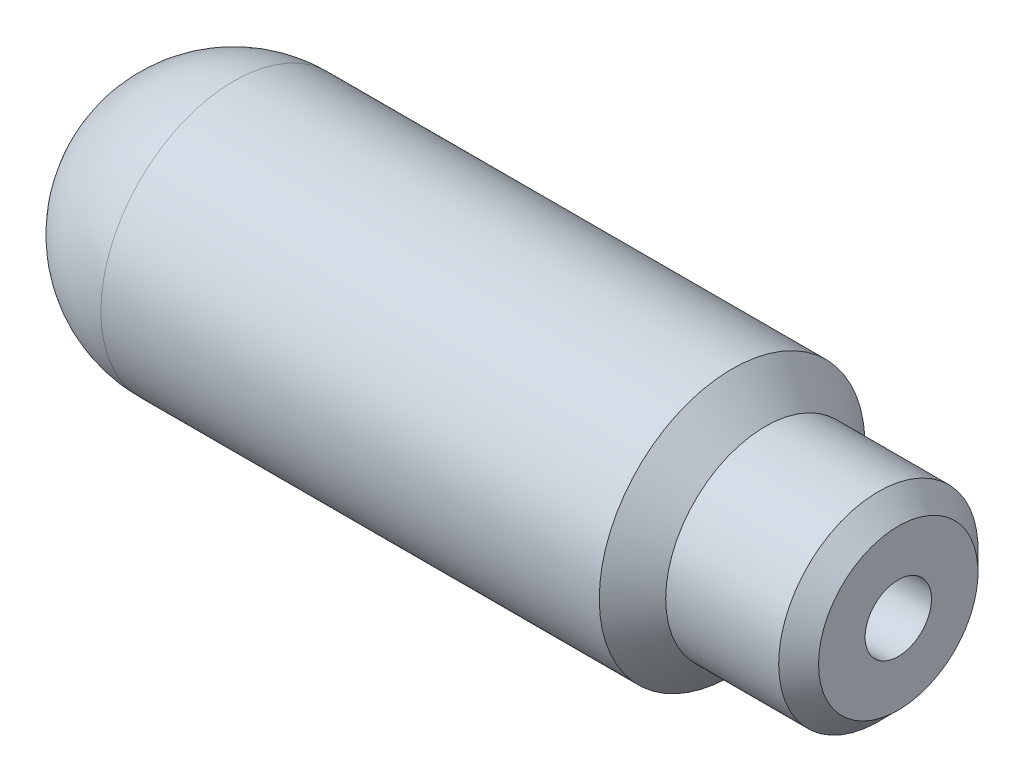
ISO-10303-21;
HEADER;
FILE_DESCRIPTION(('STEP AP214'),'2;1');
FILE_NAME('part.step','',(''),(''),'','','');
FILE_SCHEMA(('AUTOMOTIVE_DESIGN { 1 0 10303 214 1 1 1 1 }'));
ENDSEC;
DATA;
#1=APPLICATION_CONTEXT('core data for automotive mechanical design processes');
#2=APPLICATION_PROTOCOL_DEFINITION('international standard','automotive_design',2000,#1);
#3=PRODUCT_CONTEXT('',#1,'mechanical');
#4=PRODUCT('Part','Part','',(#3));
#5=PRODUCT_RELATED_PRODUCT_CATEGORY('part','',(#4));
#6=PRODUCT_DEFINITION_FORMATION('','',#4);
#7=PRODUCT_DEFINITION_CONTEXT('part definition',#1,'design');
#8=PRODUCT_DEFINITION('design','',#6,#7);
#9=PRODUCT_DEFINITION_SHAPE('','',#8);
#10=(LENGTH_UNIT() NAMED_UNIT(*) SI_UNIT(.MILLI.,.METRE.));
#11=(NAMED_UNIT(*) PLANE_ANGLE_UNIT() SI_UNIT($,.RADIAN.));
#12=(NAMED_UNIT(*) SI_UNIT($,.STERADIAN.) SOLID_ANGLE_UNIT());
#13=UNCERTAINTY_MEASURE_WITH_UNIT(LENGTH_MEASURE(1.E-05),#10,'distance_accuracy_value','');
#14=(GEOMETRIC_REPRESENTATION_CONTEXT(3) GLOBAL_UNCERTAINTY_ASSIGNED_CONTEXT((#13)) GLOBAL_UNIT_ASSIGNED_CONTEXT((#10,
#11,#12)) REPRESENTATION_CONTEXT('',''));
#15=CARTESIAN_POINT('',(0.,0.,0.));
#16=DIRECTION('',(0.,0.,1.));
#17=DIRECTION('',(1.,0.,0.));
#18=AXIS2_PLACEMENT_3D('',#15,#16,#17);
#19=CARTESIAN_POINT('',(20.,0.,0.));
#20=DIRECTION('',(-1.,0.,0.));
#21=DIRECTION('',(0.,1.,0.));
#22=AXIS2_PLACEMENT_3D('',#19,#20,#21);
#23=SPHERICAL_SURFACE('',#22,20.);
#24=CARTESIAN_POINT('',(20.,0.,0.));
#25=DIRECTION('',(-1.,0.,0.));
#26=DIRECTION('',(0.,0.,1.));
#27=AXIS2_PLACEMENT_3D('',#24,#25,#26);
#28=CIRCLE('',#27,20.);
#29=CARTESIAN_POINT('',(20.,0.,20.));
#30=VERTEX_POINT('',#29);
#31=EDGE_CURVE('E72',#30,#30,#28,.T.);
#32=ORIENTED_EDGE('',*,*,#31,.T.);
#33=EDGE_LOOP('',(#32));
#34=FACE_BOUND('',#33,.T.);
#35=ADVANCED_FACE('F41',(#34),#23,.T.);
#36=CARTESIAN_POINT('',(95.,0.,0.));
#37=DIRECTION('',(-1.,0.,0.));
#38=DIRECTION('',(0.,0.,1.));
#39=AXIS2_PLACEMENT_3D('',#36,#37,#38);
#40=PLANE('',#39);
#41=CARTESIAN_POINT('',(95.,0.,0.));
#42=DIRECTION('',(-1.,0.,0.));
#43=DIRECTION('',(0.,0.,1.));
#44=AXIS2_PLACEMENT_3D('',#41,#42,#43);
#45=CIRCLE('',#44,5.);
#46=CARTESIAN_POINT('',(95.,0.,5.));
#47=VERTEX_POINT('',#46);
#48=EDGE_CURVE('E10',#47,#47,#45,.T.);
#49=ORIENTED_EDGE('',*,*,#48,.F.);
#50=EDGE_LOOP('',(#49));
#51=FACE_BOUND('',#50,.T.);
#52=ADVANCED_FACE('F109',(#51),#40,.F.);
#53=CARTESIAN_POINT('',(0.,0.,0.));
#54=DIRECTION('',(-1.,0.,0.));
#55=DIRECTION('',(0.,0.,1.));
#56=AXIS2_PLACEMENT_3D('',#53,#54,#55);
#57=CYLINDRICAL_SURFACE('',#56,5.);
#58=CARTESIAN_POINT('',(120.,0.,0.));
#59=DIRECTION('',(-1.,0.,0.));
#60=DIRECTION('',(0.,0.,1.));
#61=AXIS2_PLACEMENT_3D('',#58,#59,#60);
#62=CIRCLE('',#61,5.);
#63=CARTESIAN_POINT('',(120.,0.,5.));
#64=VERTEX_POINT('',#63);
#65=EDGE_CURVE('E48',#64,#64,#62,.T.);
#66=ORIENTED_EDGE('',*,*,#65,.F.);
#67=EDGE_LOOP('',(#66));
#68=FACE_BOUND('',#67,.T.);
#69=ORIENTED_EDGE('',*,*,#48,.T.);
#70=EDGE_LOOP('',(#69));
#71=FACE_BOUND('',#70,.T.);
#72=ADVANCED_FACE('F104',(#68,#71),#57,.F.);
#73=CARTESIAN_POINT('',(120.,5.,0.));
#74=DIRECTION('',(-1.,0.,0.));
#75=DIRECTION('',(0.,0.,1.));
#76=AXIS2_PLACEMENT_3D('',#73,#74,#75);
#77=PLANE('',#76);
#78=CARTESIAN_POINT('',(120.,0.,0.));
#79=DIRECTION('',(-1.,0.,0.));
#80=DIRECTION('',(0.,0.,1.));
#81=AXIS2_PLACEMENT_3D('',#78,#79,#80);
#82=CIRCLE('',#81,12.);
#83=CARTESIAN_POINT('',(120.,0.,12.));
#84=VERTEX_POINT('',#83);
#85=EDGE_CURVE('E53',#84,#84,#82,.T.);
#86=ORIENTED_EDGE('',*,*,#85,.F.);
#87=EDGE_LOOP('',(#86));
#88=FACE_BOUND('',#87,.T.);
#89=ORIENTED_EDGE('',*,*,#65,.T.);
#90=EDGE_LOOP('',(#89));
#91=FACE_BOUND('',#90,.T.);
#92=ADVANCED_FACE('F99',(#88,#91),#77,.F.);
#93=CARTESIAN_POINT('',(120.,0.,0.));
#94=DIRECTION('',(-1.,0.,0.));
#95=DIRECTION('',(0.,0.,1.));
#96=AXIS2_PLACEMENT_3D('',#93,#94,#95);
#97=CONICAL_SURFACE('',#96,12.,0.785398163397448);
#98=CARTESIAN_POINT('',(117.,0.,0.));
#99=DIRECTION('',(-1.,0.,0.));
#100=DIRECTION('',(0.,0.,1.));
#101=AXIS2_PLACEMENT_3D('',#98,#99,#100);
#102=CIRCLE('',#101,15.);
#103=CARTESIAN_POINT('',(117.,0.,15.));
#104=VERTEX_POINT('',#103);
#105=EDGE_CURVE('E58',#104,#104,#102,.T.);
#106=ORIENTED_EDGE('',*,*,#105,.F.);
#107=EDGE_LOOP('',(#106));
#108=FACE_BOUND('',#107,.T.);
#109=ORIENTED_EDGE('',*,*,#85,.T.);
#110=EDGE_LOOP('',(#109));
#111=FACE_BOUND('',#110,.T.);
#112=ADVANCED_FACE('F93',(#108,#111),#97,.T.);
#113=CARTESIAN_POINT('',(0.,0.,0.));
#114=DIRECTION('',(-1.,0.,0.));
#115=DIRECTION('',(0.,0.,1.));
#116=AXIS2_PLACEMENT_3D('',#113,#114,#115);
#117=CYLINDRICAL_SURFACE('',#116,15.);
#118=CARTESIAN_POINT('',(100.,0.,0.));
#119=DIRECTION('',(-1.,0.,0.));
#120=DIRECTION('',(0.,0.,1.));
#121=AXIS2_PLACEMENT_3D('',#118,#119,#120);
#122=CIRCLE('',#121,15.);
#123=CARTESIAN_POINT('',(100.,0.,15.));
#124=VERTEX_POINT('',#123);
#125=EDGE_CURVE('E64',#124,#124,#122,.T.);
#126=ORIENTED_EDGE('',*,*,#125,.F.);
#127=EDGE_LOOP('',(#126));
#128=FACE_BOUND('',#127,.T.);
#129=ORIENTED_EDGE('',*,*,#105,.T.);
#130=EDGE_LOOP('',(#129));
#131=FACE_BOUND('',#130,.T.);
#132=ADVANCED_FACE('F87',(#128,#131),#117,.T.);
#133=CARTESIAN_POINT('',(100.,0.,0.));
#134=DIRECTION('',(-1.,0.,0.));
#135=DIRECTION('',(0.,0.,1.));
#136=AXIS2_PLACEMENT_3D('',#133,#134,#135);
#137=CONICAL_SURFACE('',#136,15.,0.78539816339745);
#138=CARTESIAN_POINT('',(95.,0.,0.));
#139=DIRECTION('',(-1.,0.,0.));
#140=DIRECTION('',(0.,0.,1.));
#141=AXIS2_PLACEMENT_3D('',#138,#139,#140);
#142=CIRCLE('',#141,20.);
#143=CARTESIAN_POINT('',(95.,0.,20.));
#144=VERTEX_POINT('',#143);
#145=EDGE_CURVE('E68',#144,#144,#142,.T.);
#146=ORIENTED_EDGE('',*,*,#145,.F.);
#147=EDGE_LOOP('',(#146));
#148=FACE_BOUND('',#147,.T.);
#149=ORIENTED_EDGE('',*,*,#125,.T.);
#150=EDGE_LOOP('',(#149));
#151=FACE_BOUND('',#150,.T.);
#152=ADVANCED_FACE('F81',(#148,#151),#137,.T.);
#153=CARTESIAN_POINT('',(0.,0.,0.));
#154=DIRECTION('',(-1.,0.,0.));
#155=DIRECTION('',(0.,0.,1.));
#156=AXIS2_PLACEMENT_3D('',#153,#154,#155);
#157=CYLINDRICAL_SURFACE('',#156,20.);
#158=ORIENTED_EDGE('',*,*,#31,.F.);
#159=EDGE_LOOP('',(#158));
#160=FACE_BOUND('',#159,.T.);
#161=ORIENTED_EDGE('',*,*,#145,.T.);
#162=EDGE_LOOP('',(#161));
#163=FACE_BOUND('',#162,.T.);
#164=ADVANCED_FACE('F78',(#160,#163),#157,.T.);
#165=CLOSED_SHELL('',(#35,#52,#72,#92,#112,#132,#152,#164));
#166=MANIFOLD_SOLID_BREP('B2',#165);
#167=ADVANCED_BREP_SHAPE_REPRESENTATION('',(#18,#166),#14);
#168=SHAPE_DEFINITION_REPRESENTATION(#9,#167);
ENDSEC;
END-ISO-10303-21;
